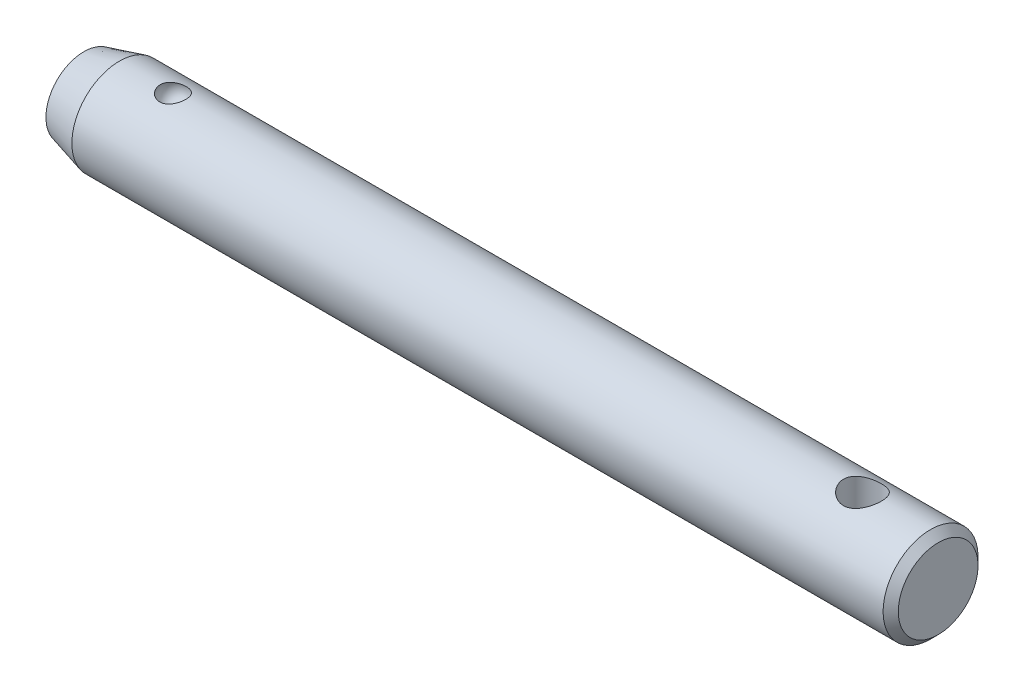
ISO-10303-21;
HEADER;
FILE_DESCRIPTION(('STEP AP214'),'2;1');
FILE_NAME('part.step','',(''),(''),'','','');
FILE_SCHEMA(('AUTOMOTIVE_DESIGN { 1 0 10303 214 1 1 1 1 }'));
ENDSEC;
DATA;
#1=APPLICATION_CONTEXT('core data for automotive mechanical design processes');
#2=APPLICATION_PROTOCOL_DEFINITION('international standard','automotive_design',2000,#1);
#3=PRODUCT_CONTEXT('',#1,'mechanical');
#4=PRODUCT('Part','Part','',(#3));
#5=PRODUCT_RELATED_PRODUCT_CATEGORY('part','',(#4));
#6=PRODUCT_DEFINITION_FORMATION('','',#4);
#7=PRODUCT_DEFINITION_CONTEXT('part definition',#1,'design');
#8=PRODUCT_DEFINITION('design','',#6,#7);
#9=PRODUCT_DEFINITION_SHAPE('','',#8);
#10=(LENGTH_UNIT() NAMED_UNIT(*) SI_UNIT(.MILLI.,.METRE.));
#11=(NAMED_UNIT(*) PLANE_ANGLE_UNIT() SI_UNIT($,.RADIAN.));
#12=(NAMED_UNIT(*) SI_UNIT($,.STERADIAN.) SOLID_ANGLE_UNIT());
#13=UNCERTAINTY_MEASURE_WITH_UNIT(LENGTH_MEASURE(1.E-05),#10,'distance_accuracy_value','');
#14=(GEOMETRIC_REPRESENTATION_CONTEXT(3) GLOBAL_UNCERTAINTY_ASSIGNED_CONTEXT((#13)) GLOBAL_UNIT_ASSIGNED_CONTEXT((#10,
#11,#12)) REPRESENTATION_CONTEXT('',''));
#15=CARTESIAN_POINT('',(0.,0.,0.));
#16=DIRECTION('',(0.,0.,1.));
#17=DIRECTION('',(1.,0.,0.));
#18=AXIS2_PLACEMENT_3D('',#15,#16,#17);
#19=CARTESIAN_POINT('',(21.4249,2.00025000000003,0.));
#20=DIRECTION('',(-1.,0.,0.));
#21=DIRECTION('',(0.,-1.,0.));
#22=AXIS2_PLACEMENT_3D('',#19,#20,#21);
#23=PLANE('',#22);
#24=CARTESIAN_POINT('',(21.4248999999995,0.,0.));
#25=DIRECTION('',(-1.,0.,0.));
#26=DIRECTION('',(0.,0.,1.));
#27=AXIS2_PLACEMENT_3D('',#24,#25,#26);
#28=CIRCLE('',#27,2.00025000003734);
#29=CARTESIAN_POINT('',(21.4248999999995,0.,2.00025000003734));
#30=VERTEX_POINT('',#29);
#31=EDGE_CURVE('E20',#30,#30,#28,.T.);
#32=ORIENTED_EDGE('',*,*,#31,.F.);
#33=EDGE_LOOP('',(#32));
#34=FACE_BOUND('',#33,.T.);
#35=ADVANCED_FACE('F17',(#34),#23,.F.);
#36=CARTESIAN_POINT('',(-21.4249,1.905,0.));
#37=DIRECTION('',(1.,0.,0.));
#38=DIRECTION('',(0.,1.,0.));
#39=AXIS2_PLACEMENT_3D('',#36,#37,#38);
#40=PLANE('',#39);
#41=CARTESIAN_POINT('',(-21.4249000000564,0.,0.));
#42=DIRECTION('',(1.,0.,0.));
#43=DIRECTION('',(0.,0.,-1.));
#44=AXIS2_PLACEMENT_3D('',#41,#42,#43);
#45=CIRCLE('',#44,1.90500000000885);
#46=CARTESIAN_POINT('',(-21.4249000000564,0.,-1.90500000000885));
#47=VERTEX_POINT('',#46);
#48=EDGE_CURVE('E80',#47,#47,#45,.T.);
#49=ORIENTED_EDGE('',*,*,#48,.F.);
#50=EDGE_LOOP('',(#49));
#51=FACE_BOUND('',#50,.T.);
#52=ADVANCED_FACE('F89',(#51),#40,.F.);
#53=CARTESIAN_POINT('',(21.0439000001088,0.,0.));
#54=DIRECTION('',(-1.,0.,0.));
#55=DIRECTION('',(0.,0.,1.));
#56=AXIS2_PLACEMENT_3D('',#53,#54,#55);
#57=CONICAL_SURFACE('',#56,2.38124999992806,0.785398163397448);
#58=CARTESIAN_POINT('',(21.0439,0.,0.));
#59=DIRECTION('',(-1.,0.,0.));
#60=DIRECTION('',(0.,-1.,0.));
#61=AXIS2_PLACEMENT_3D('',#58,#59,#60);
#62=CIRCLE('',#61,2.38125);
#63=CARTESIAN_POINT('',(21.0439,-2.38125000000001,0.));
#64=VERTEX_POINT('',#63);
#65=EDGE_CURVE('E43',#64,#64,#62,.T.);
#66=ORIENTED_EDGE('',*,*,#65,.F.);
#67=EDGE_LOOP('',(#66));
#68=FACE_BOUND('',#67,.T.);
#69=ORIENTED_EDGE('',*,*,#31,.T.);
#70=EDGE_LOOP('',(#69));
#71=FACE_BOUND('',#70,.T.);
#72=ADVANCED_FACE('F32',(#68,#71),#57,.T.);
#73=CARTESIAN_POINT('',(-16.95746933077,2.143125,0.));
#74=DIRECTION('',(0.,1.,0.));
#75=DIRECTION('',(1.,0.,0.));
#76=AXIS2_PLACEMENT_3D('',#73,#74,#75);
#77=SPHERICAL_SURFACE('',#76,0.682624999999999);
#78=CARTESIAN_POINT('',(-16.95746933077,1.4605,0.));
#79=VERTEX_POINT('',#78);
#80=VERTEX_LOOP('',#79);
#81=FACE_BOUND('',#80,.T.);
#82=CARTESIAN_POINT('',(-16.3177245574424,2.38125,0.));
#83=CARTESIAN_POINT('',(-16.3177253677787,2.38124937289952,0.0381350441003204));
#84=CARTESIAN_POINT('',(-16.3207994036191,2.38032541169528,0.0762785130369543));
#85=CARTESIAN_POINT('',(-16.3330482914089,2.37672191128368,0.151552622755821));
#86=CARTESIAN_POINT('',(-16.3422337720925,2.37403931365901,0.188681381478269));
#87=CARTESIAN_POINT('',(-16.3665265131778,2.36720350054489,0.260788113248953));
#88=CARTESIAN_POINT('',(-16.3816309706073,2.36305098123685,0.295767095281833));
#89=CARTESIAN_POINT('',(-16.4174492148012,2.35372684236225,0.362574166634676));
#90=CARTESIAN_POINT('',(-16.4381622449431,2.34855536028411,0.394402680177171));
#91=CARTESIAN_POINT('',(-16.4845541803152,2.33781881963637,0.453714841996176));
#92=CARTESIAN_POINT('',(-16.5101915963913,2.33225727992687,0.481231527923191));
#93=CARTESIAN_POINT('',(-16.5659299367686,2.32135041050113,0.531360055651512));
#94=CARTESIAN_POINT('',(-16.5960303955105,2.31600505830737,0.553972408439839));
#95=CARTESIAN_POINT('',(-16.6588446535189,2.30634787745912,0.592875406584319));
#96=CARTESIAN_POINT('',(-16.6914411372026,2.30200801714359,0.609348246951435));
#97=CARTESIAN_POINT('',(-16.7591333684968,2.29467577614861,0.636406286471084));
#98=CARTESIAN_POINT('',(-16.7942282311991,2.29168292109253,0.646993558661371));
#99=CARTESIAN_POINT('',(-16.8640892708424,2.28752841641015,0.66152846609814));
#100=CARTESIAN_POINT('',(-16.8987889715677,2.28628506064821,0.665772974380508));
#101=CARTESIAN_POINT('',(-16.9684270108427,2.28551023878046,0.66842865805681));
#102=CARTESIAN_POINT('',(-17.00336530134,2.28597843755574,0.666840975381616));
#103=CARTESIAN_POINT('',(-17.0714381040601,2.28853233510444,0.658020344958105));
#104=CARTESIAN_POINT('',(-17.1045956363411,2.29057147672235,0.650949849350848));
#105=CARTESIAN_POINT('',(-17.1692343577586,2.29598329010998,0.631595129596202));
#106=CARTESIAN_POINT('',(-17.2007154559033,2.29935603418002,0.619310622772217));
#107=CARTESIAN_POINT('',(-17.2616638874353,2.3071331808023,0.589682089659259));
#108=CARTESIAN_POINT('',(-17.2910927553238,2.31155266711654,0.572263079834961));
#109=CARTESIAN_POINT('',(-17.3466974555343,2.32092935249309,0.532959336334129));
#110=CARTESIAN_POINT('',(-17.3728728654811,2.32588662121603,0.511074023799148));
#111=CARTESIAN_POINT('',(-17.422501568537,2.33606772374327,0.462367802451901));
#112=CARTESIAN_POINT('',(-17.4457807719319,2.34129356408862,0.435369936437008));
#113=CARTESIAN_POINT('',(-17.4876970506828,2.35125350817705,0.37790014743016));
#114=CARTESIAN_POINT('',(-17.5063328242859,2.35598747381014,0.3474272537208));
#115=CARTESIAN_POINT('',(-17.5392787427023,2.36467259289021,0.282474719554657));
#116=CARTESIAN_POINT('',(-17.5533740732921,2.36858246454471,0.247880485066725));
#117=CARTESIAN_POINT('',(-17.575830876903,2.37494397132871,0.176811415168422));
#118=CARTESIAN_POINT('',(-17.5842013329655,2.37739789022402,0.140339623037332));
#119=CARTESIAN_POINT('',(-17.5946849223732,2.38049081718998,0.0692037689284664));
#120=CARTESIAN_POINT('',(-17.5972148394312,2.38125056905701,0.0346053531866554));
#121=CARTESIAN_POINT('',(-17.5972132937615,2.38124937289897,-0.0381350441002635));
#122=CARTESIAN_POINT('',(-17.594139257921,2.38032541169514,-0.0762785130369269));
#123=CARTESIAN_POINT('',(-17.581890370131,2.37672191128383,-0.151552622755857));
#124=CARTESIAN_POINT('',(-17.5727048894474,2.37403931365904,-0.188681381478339));
#125=CARTESIAN_POINT('',(-17.5484121483621,2.36720350054484,-0.260788113249051));
#126=CARTESIAN_POINT('',(-17.5333076909326,2.36305098123682,-0.295767095281928));
#127=CARTESIAN_POINT('',(-17.4974894467387,2.35372684236224,-0.362574166634766));
#128=CARTESIAN_POINT('',(-17.4767764165968,2.3485553602841,-0.394402680177259));
#129=CARTESIAN_POINT('',(-17.4303844812248,2.33781881963635,-0.453714841996257));
#130=CARTESIAN_POINT('',(-17.4047470651486,2.33225727992686,-0.481231527923266));
#131=CARTESIAN_POINT('',(-17.3490087247713,2.32135041050112,-0.531360055651576));
#132=CARTESIAN_POINT('',(-17.3189082660294,2.31600505830735,-0.553972408439898));
#133=CARTESIAN_POINT('',(-17.256094008021,2.30634787745911,-0.592875406584368));
#134=CARTESIAN_POINT('',(-17.2234975243373,2.30200801714357,-0.609348246951479));
#135=CARTESIAN_POINT('',(-17.1558052930431,2.2946757761486,-0.636406286471115));
#136=CARTESIAN_POINT('',(-17.1207104303408,2.29168292109253,-0.646993558661396));
#137=CARTESIAN_POINT('',(-17.0508493906975,2.28752841641014,-0.661528466098153));
#138=CARTESIAN_POINT('',(-17.0161496899722,2.28628506064821,-0.665772974380516));
#139=CARTESIAN_POINT('',(-16.9465116506972,2.28551023878046,-0.668428658056808));
#140=CARTESIAN_POINT('',(-16.9115733601999,2.28597843755574,-0.66684097538161));
#141=CARTESIAN_POINT('',(-16.8435005574798,2.28853233510444,-0.658020344958089));
#142=CARTESIAN_POINT('',(-16.8103430251988,2.29057147672236,-0.650949849350826));
#143=CARTESIAN_POINT('',(-16.7457043037813,2.29598329010999,-0.63159512959617));
#144=CARTESIAN_POINT('',(-16.7142232056366,2.29935603418003,-0.61931062277218));
#145=CARTESIAN_POINT('',(-16.6532747741046,2.30713318080232,-0.589682089659211));
#146=CARTESIAN_POINT('',(-16.6238459062161,2.31155266711655,-0.572263079834907));
#147=CARTESIAN_POINT('',(-16.5682412060056,2.3209293524931,-0.532959336334067));
#148=CARTESIAN_POINT('',(-16.5420657960588,2.32588662121605,-0.511074023799085));
#149=CARTESIAN_POINT('',(-16.4924370930029,2.33606772374329,-0.462367802451831));
#150=CARTESIAN_POINT('',(-16.469157889608,2.34129356408864,-0.435369936436933));
#151=CARTESIAN_POINT('',(-16.4272416108572,2.35125350817706,-0.377900147430077));
#152=CARTESIAN_POINT('',(-16.4086058372541,2.35598747381014,-0.347427253720714));
#153=CARTESIAN_POINT('',(-16.3756599188376,2.36467259289023,-0.282474719554562));
#154=CARTESIAN_POINT('',(-16.3615645882478,2.36858246454476,-0.247880485066625));
#155=CARTESIAN_POINT('',(-16.339107784637,2.37494397132868,-0.176811415168318));
#156=CARTESIAN_POINT('',(-16.3307373285744,2.37739789022388,-0.140339623037229));
#157=CARTESIAN_POINT('',(-16.3202537391669,2.38049081719013,-0.0692037689283692));
#158=CARTESIAN_POINT('',(-16.3177238221089,2.38125056905751,-0.0346053531865637));
#159=CARTESIAN_POINT('',(-16.3177245574424,2.38125,0.));
#160=B_SPLINE_CURVE_WITH_KNOTS('',3,(#82,#83,#84,#85,#86,#87,#88,#89,#90,#91,#92,#93,#94,#95,
#96,#97,#98,#99,#100,#101,#102,#103,#104,#105,#106,#107,#108,#109,#110,#111,#112,#113,#114,#115,
#116,#117,#118,#119,#120,#121,#122,#123,#124,#125,#126,#127,#128,#129,#130,#131,#132,#133,#134,
#135,#136,#137,#138,#139,#140,#141,#142,#143,#144,#145,#146,#147,#148,#149,#150,#151,#152,#153,
#154,#155,#156,#157,#158,#159),.UNSPECIFIED.,.T.,.F.,(4,2,2,2,2,2,2,2,2,2,2,2,2,2,2,2,2,2,2,2,2,
2,2,2,2,2,2,2,2,2,2,2,2,2,2,2,2,2,4),(0.,0.114285787788637,0.228770857351951,0.343201777111528,
0.457617267292192,0.571108008249131,0.684586918813929,0.794363165868979,0.904100722568208,
1.0085208062489,1.11292044578402,1.21433973590153,1.31576452514846,1.41875082995503,
1.52175049086385,1.62935647994241,1.73699260174923,1.84915426923597,1.96113953480586,
2.0648472961035,2.17913308389223,2.29361815345565,2.40804907321523,2.52246456339589,
2.63595530435283,2.74943421491763,2.85921046197267,2.9689480186719,3.07336810235259,
3.1777677418877,3.2791870320052,3.38061182125215,3.48359812605872,3.58659778696753,
3.6942037760461,3.80183989785292,3.91400156533966,4.02598683090955,4.12969459220718),.UNSPECIFIED.);
#161=CARTESIAN_POINT('',(-16.3177245574424,2.38125,0.));
#162=VERTEX_POINT('',#161);
#163=EDGE_CURVE('E36',#162,#162,#160,.T.);
#164=ORIENTED_EDGE('',*,*,#163,.F.);
#165=EDGE_LOOP('',(#164));
#166=FACE_BOUND('',#165,.T.);
#167=ADVANCED_FACE('F28',(#81,#166),#77,.F.);
#168=CARTESIAN_POINT('',(-19.647510803054,0.,0.));
#169=DIRECTION('',(1.,0.,0.));
#170=DIRECTION('',(0.,0.,-1.));
#171=AXIS2_PLACEMENT_3D('',#168,#169,#170);
#172=CONICAL_SURFACE('',#171,2.38124999998491,0.261799387800982);
#173=CARTESIAN_POINT('',(-19.6475108028953,0.,0.));
#174=DIRECTION('',(-1.,0.,0.));
#175=DIRECTION('',(0.,-1.,0.));
#176=AXIS2_PLACEMENT_3D('',#173,#174,#175);
#177=CIRCLE('',#176,2.38125);
#178=CARTESIAN_POINT('',(-19.6475108028953,-2.38125000000001,0.));
#179=VERTEX_POINT('',#178);
#180=EDGE_CURVE('E24',#179,#179,#177,.F.);
#181=ORIENTED_EDGE('',*,*,#180,.F.);
#182=EDGE_LOOP('',(#181));
#183=FACE_BOUND('',#182,.T.);
#184=ORIENTED_EDGE('',*,*,#48,.T.);
#185=EDGE_LOOP('',(#184));
#186=FACE_BOUND('',#185,.T.);
#187=ADVANCED_FACE('F31',(#183,#186),#172,.T.);
#188=CARTESIAN_POINT('',(17.6276,-2.38125,0.));
#189=DIRECTION('',(0.,-1.,0.));
#190=DIRECTION('',(0.,0.,-1.));
#191=AXIS2_PLACEMENT_3D('',#188,#189,#190);
#192=CYLINDRICAL_SURFACE('',#191,0.952500000000002);
#193=CARTESIAN_POINT('',(18.5801,2.38125,0.));
#194=CARTESIAN_POINT('',(18.5800980217383,2.38124840660397,0.0512827656094126));
#195=CARTESIAN_POINT('',(18.5759407010468,2.37957694408214,0.102586796659491));
#196=CARTESIAN_POINT('',(18.5594785352757,2.37306501909924,0.203682087632428));
#197=CARTESIAN_POINT('',(18.5471674227995,2.36822211895086,0.253472153033092));
#198=CARTESIAN_POINT('',(18.5149166648044,2.35588746377405,0.350013478905893));
#199=CARTESIAN_POINT('',(18.4949962709171,2.34840239707701,0.396772062688192));
#200=CARTESIAN_POINT('',(18.4481818652031,2.33151762770134,0.486265202892904));
#201=CARTESIAN_POINT('',(18.4212870858417,2.32211771431728,0.528999315714161));
#202=CARTESIAN_POINT('',(18.3599611467132,2.3018635857919,0.611266618074458));
#203=CARTESIAN_POINT('',(18.3252573594166,2.29096442801425,0.650585393098528));
#204=CARTESIAN_POINT('',(18.2498697803088,2.26914400356924,0.723029308056852));
#205=CARTESIAN_POINT('',(18.2091828098871,2.25822272821218,0.756151134431016));
#206=CARTESIAN_POINT('',(18.120773138379,2.23705014726573,0.816722084731498));
#207=CARTESIAN_POINT('',(18.0728164700112,2.2268509838443,0.84384950449439));
#208=CARTESIAN_POINT('',(17.9725761309017,2.20900130857024,0.889534663446545));
#209=CARTESIAN_POINT('',(17.9202982876186,2.20134743200664,0.908103728889349));
#210=CARTESIAN_POINT('',(17.8277882680257,2.19127207963432,0.932091749820611));
#211=CARTESIAN_POINT('',(17.7882118093933,2.18798962263678,0.939725273965529));
#212=CARTESIAN_POINT('',(17.7082946117372,2.18357875032177,0.94992977692222));
#213=CARTESIAN_POINT('',(17.6679540109268,2.18244994915176,0.952501662588163));
#214=CARTESIAN_POINT('',(17.5765021243126,2.18245385971025,0.952497894763837));
#215=CARTESIAN_POINT('',(17.5253827473202,2.18426869119329,0.948369453498012));
#216=CARTESIAN_POINT('',(17.4246721774556,2.19128781657014,0.93203249578508));
#217=CARTESIAN_POINT('',(17.3750823417164,2.19649503471655,0.919817008120197));
#218=CARTESIAN_POINT('',(17.2789669819132,2.20961020525916,0.887845262326929));
#219=CARTESIAN_POINT('',(17.2324324543509,2.21750975447778,0.868112444637582));
#220=CARTESIAN_POINT('',(17.1433254060443,2.235107422601,0.821741550167197));
#221=CARTESIAN_POINT('',(17.1007535402929,2.24480583805226,0.795102334564372));
#222=CARTESIAN_POINT('',(17.0183534111591,2.26552501969827,0.734055676826382));
#223=CARTESIAN_POINT('',(16.9787802584988,2.27658820515947,0.699318188648871));
#224=CARTESIAN_POINT('',(16.905831454361,2.29844113921793,0.623751253107263));
#225=CARTESIAN_POINT('',(16.8724583639749,2.30923077323579,0.582919300775681));
#226=CARTESIAN_POINT('',(16.8115774707875,2.32983559061388,0.494332996236024));
#227=CARTESIAN_POINT('',(16.7843562194164,2.33959484612527,0.446367704847795));
#228=CARTESIAN_POINT('',(16.7384996792298,2.35650964032114,0.346102441235495));
#229=CARTESIAN_POINT('',(16.7198538297207,2.3636683792713,0.293807894741356));
#230=CARTESIAN_POINT('',(16.6956971550235,2.373068376679,0.201108315405993));
#231=CARTESIAN_POINT('',(16.6879920704473,2.37611790892317,0.161343999032472));
#232=CARTESIAN_POINT('',(16.6776930392673,2.38020922140588,0.081057485167966));
#233=CARTESIAN_POINT('',(16.6750984363246,2.38125125946645,0.0405353856739462));
#234=CARTESIAN_POINT('',(16.6751019782617,2.38124840660397,-0.0512827656094111));
#235=CARTESIAN_POINT('',(16.6792592989532,2.37957694408214,-0.102586796659489));
#236=CARTESIAN_POINT('',(16.6957214647243,2.37306501909924,-0.203682087632426));
#237=CARTESIAN_POINT('',(16.7080325772005,2.36822211895086,-0.253472153033091));
#238=CARTESIAN_POINT('',(16.7402833351956,2.35588746377405,-0.350013478905893));
#239=CARTESIAN_POINT('',(16.7602037290829,2.34840239707701,-0.396772062688193));
#240=CARTESIAN_POINT('',(16.8070181347969,2.33151762770134,-0.486265202892905));
#241=CARTESIAN_POINT('',(16.8339129141583,2.32211771431728,-0.528999315714161));
#242=CARTESIAN_POINT('',(16.8952388532868,2.3018635857919,-0.611266618074458));
#243=CARTESIAN_POINT('',(16.9299426405834,2.29096442801425,-0.650585393098528));
#244=CARTESIAN_POINT('',(17.0053302196912,2.26914400356924,-0.723029308056852));
#245=CARTESIAN_POINT('',(17.0460171901129,2.25822272821218,-0.756151134431016));
#246=CARTESIAN_POINT('',(17.134426861621,2.23705014726573,-0.816722084731498));
#247=CARTESIAN_POINT('',(17.1823835299888,2.2268509838443,-0.84384950449439));
#248=CARTESIAN_POINT('',(17.2826238690983,2.20900130857024,-0.889534663446545));
#249=CARTESIAN_POINT('',(17.3349017123814,2.20134743200664,-0.908103728889349));
#250=CARTESIAN_POINT('',(17.4274117319742,2.19127207963433,-0.932091749820586));
#251=CARTESIAN_POINT('',(17.4669881906065,2.18798962263679,-0.939725273965491));
#252=CARTESIAN_POINT('',(17.5469053882624,2.18357875032179,-0.949929776922182));
#253=CARTESIAN_POINT('',(17.5872459890727,2.18244994915177,-0.952501662588137));
#254=CARTESIAN_POINT('',(17.6786978756868,2.18245385971024,-0.95249789476387));
#255=CARTESIAN_POINT('',(17.7298172526792,2.18426869119326,-0.948369453498079));
#256=CARTESIAN_POINT('',(17.8305278225438,2.19128781657008,-0.932032495785215));
#257=CARTESIAN_POINT('',(17.880117658283,2.19649503471648,-0.919817008120366));
#258=CARTESIAN_POINT('',(17.9762330180862,2.20961020525907,-0.887845262327166));
#259=CARTESIAN_POINT('',(18.0227675456485,2.21750975447768,-0.868112444637852));
#260=CARTESIAN_POINT('',(18.1118745939552,2.23510742260088,-0.821741550167533));
#261=CARTESIAN_POINT('',(18.1544464597066,2.24480583805213,-0.795102334564741));
#262=CARTESIAN_POINT('',(18.2368465888404,2.26552501969813,-0.734055676826817));
#263=CARTESIAN_POINT('',(18.2764197415008,2.27658820515932,-0.699318188649339));
#264=CARTESIAN_POINT('',(18.3493685456386,2.29844113921779,-0.623751253107797));
#265=CARTESIAN_POINT('',(18.3827416360246,2.30923077323565,-0.582919300776248));
#266=CARTESIAN_POINT('',(18.4436225292122,2.32983559061374,-0.494332996236646));
#267=CARTESIAN_POINT('',(18.4708437805833,2.33959484612515,-0.446367704848438));
#268=CARTESIAN_POINT('',(18.5167003207699,2.35650964032104,-0.346102441236175));
#269=CARTESIAN_POINT('',(18.5353461702791,2.36366837927121,-0.293807894742051));
#270=CARTESIAN_POINT('',(18.5595028449764,2.37306837667896,-0.20110831540659));
#271=CARTESIAN_POINT('',(18.5672079295527,2.37611790892314,-0.161343999032953));
#272=CARTESIAN_POINT('',(18.5775069607327,2.38020922140587,-0.0810574851682095));
#273=CARTESIAN_POINT('',(18.5801015636754,2.38125125946645,-0.0405353856740674));
#274=CARTESIAN_POINT('',(18.5801,2.38125,0.));
#275=B_SPLINE_CURVE_WITH_KNOTS('',3,(#193,#194,#195,#196,#197,#198,#199,#200,#201,#202,#203,
#204,#205,#206,#207,#208,#209,#210,#211,#212,#213,#214,#215,#216,#217,#218,#219,#220,#221,#222,
#223,#224,#225,#226,#227,#228,#229,#230,#231,#232,#233,#234,#235,#236,#237,#238,#239,#240,#241,
#242,#243,#244,#245,#246,#247,#248,#249,#250,#251,#252,#253,#254,#255,#256,#257,#258,#259,#260,
#261,#262,#263,#264,#265,#266,#267,#268,#269,#270,#271,#272,#273,#274),.UNSPECIFIED.,.T.,.F.,(4,
2,2,2,2,2,2,2,2,2,2,2,2,2,2,2,2,2,2,2,2,2,2,2,2,2,2,2,2,2,2,2,2,2,2,2,2,2,2,2,4),(0.,
0.153694272295808,0.307506818720828,0.460932766588978,0.614375606233235,0.774366387019257,
0.93444247323325,1.10171015703485,1.26875583613258,1.38971674025211,1.51065597077915,
1.66379410067692,1.81706441130927,1.96986065737973,2.12268211463725,2.28339324165391,
2.44417060754488,2.61135160370942,2.77832615982928,2.89982617665344,3.02131058821653,
3.17500486051233,3.32881740693735,3.48224335480551,3.63568619444976,3.79567697523578,
3.95575306144978,4.12302074525138,4.2900664243491,4.41102732846834,4.53196655899507,
4.68510468889282,4.83837499952515,4.99117124559559,5.1439927028531,5.30470382986973,
5.46548119576068,5.63266219192521,5.79963674804508,5.92113676486961,6.04262117643306),.UNSPECIFIED.);
#276=CARTESIAN_POINT('',(18.5801,2.38125,0.));
#277=VERTEX_POINT('',#276);
#278=EDGE_CURVE('E38',#277,#277,#275,.T.);
#279=ORIENTED_EDGE('',*,*,#278,.F.);
#280=EDGE_LOOP('',(#279));
#281=FACE_BOUND('',#280,.T.);
#282=CARTESIAN_POINT('',(16.6751,-2.38125000000001,0.));
#283=CARTESIAN_POINT('',(16.6751019782617,-2.38124840660398,0.051282765609412));
#284=CARTESIAN_POINT('',(16.6792592989532,-2.37957694408215,0.10258679665949));
#285=CARTESIAN_POINT('',(16.6957214647243,-2.37306501909924,0.203682087632427));
#286=CARTESIAN_POINT('',(16.7080325772005,-2.36822211895087,0.253472153033091));
#287=CARTESIAN_POINT('',(16.7402833351956,-2.35588746377406,0.350013478905893));
#288=CARTESIAN_POINT('',(16.7602037290829,-2.34840239707701,0.396772062688193));
#289=CARTESIAN_POINT('',(16.8070181347969,-2.33151762770135,0.486265202892905));
#290=CARTESIAN_POINT('',(16.8339129141583,-2.32211771431729,0.528999315714161));
#291=CARTESIAN_POINT('',(16.8952388532868,-2.30186358579191,0.611266618074458));
#292=CARTESIAN_POINT('',(16.9299426405834,-2.29096442801425,0.650585393098528));
#293=CARTESIAN_POINT('',(17.0053302196912,-2.26914400356924,0.723029308056852));
#294=CARTESIAN_POINT('',(17.0460171901129,-2.25822272821219,0.756151134431016));
#295=CARTESIAN_POINT('',(17.134426861621,-2.23705014726573,0.816722084731498));
#296=CARTESIAN_POINT('',(17.1823835299888,-2.2268509838443,0.84384950449439));
#297=CARTESIAN_POINT('',(17.2826238690983,-2.20900130857025,0.889534663446545));
#298=CARTESIAN_POINT('',(17.3349017123814,-2.20134743200664,0.908103728889349));
#299=CARTESIAN_POINT('',(17.4274117319743,-2.19127207963433,0.932091749820612));
#300=CARTESIAN_POINT('',(17.4669881906068,-2.18798962263678,0.93972527396553));
#301=CARTESIAN_POINT('',(17.5469053882628,-2.18357875032177,0.94992977692222));
#302=CARTESIAN_POINT('',(17.5872459890733,-2.18244994915176,0.952501662588163));
#303=CARTESIAN_POINT('',(17.6786978756874,-2.18245385971026,0.952497894763837));
#304=CARTESIAN_POINT('',(17.7298172526799,-2.18426869119329,0.948369453498012));
#305=CARTESIAN_POINT('',(17.8305278225444,-2.19128781657014,0.93203249578508));
#306=CARTESIAN_POINT('',(17.8801176582836,-2.19649503471655,0.919817008120197));
#307=CARTESIAN_POINT('',(17.9762330180868,-2.20961020525917,0.887845262326929));
#308=CARTESIAN_POINT('',(18.0227675456491,-2.21750975447778,0.868112444637583));
#309=CARTESIAN_POINT('',(18.1118745939557,-2.235107422601,0.821741550167198));
#310=CARTESIAN_POINT('',(18.1544464597071,-2.24480583805227,0.795102334564373));
#311=CARTESIAN_POINT('',(18.2368465888409,-2.26552501969827,0.734055676826382));
#312=CARTESIAN_POINT('',(18.2764197415013,-2.27658820515947,0.69931818864887));
#313=CARTESIAN_POINT('',(18.349368545639,-2.29844113921794,0.623751253107262));
#314=CARTESIAN_POINT('',(18.3827416360251,-2.30923077323579,0.58291930077568));
#315=CARTESIAN_POINT('',(18.4436225292126,-2.32983559061388,0.494332996236024));
#316=CARTESIAN_POINT('',(18.4708437805837,-2.33959484612527,0.446367704847795));
#317=CARTESIAN_POINT('',(18.5167003207702,-2.35650964032114,0.346102441235495));
#318=CARTESIAN_POINT('',(18.5353461702793,-2.3636683792713,0.293807894741356));
#319=CARTESIAN_POINT('',(18.5595028449765,-2.37306837667901,0.201108315405992));
#320=CARTESIAN_POINT('',(18.5672079295528,-2.37611790892318,0.161343999032472));
#321=CARTESIAN_POINT('',(18.5775069607327,-2.38020922140588,0.0810574851679659));
#322=CARTESIAN_POINT('',(18.5801015636754,-2.38125125946645,0.0405353856739459));
#323=CARTESIAN_POINT('',(18.5800980217383,-2.38124840660398,-0.051282765609412));
#324=CARTESIAN_POINT('',(18.5759407010468,-2.37957694408214,-0.10258679665949));
#325=CARTESIAN_POINT('',(18.5594785352757,-2.37306501909924,-0.203682087632427));
#326=CARTESIAN_POINT('',(18.5471674227995,-2.36822211895087,-0.253472153033091));
#327=CARTESIAN_POINT('',(18.5149166648044,-2.35588746377406,-0.350013478905893));
#328=CARTESIAN_POINT('',(18.4949962709171,-2.34840239707701,-0.396772062688192));
#329=CARTESIAN_POINT('',(18.4481818652031,-2.33151762770135,-0.486265202892904));
#330=CARTESIAN_POINT('',(18.4212870858417,-2.32211771431729,-0.528999315714161));
#331=CARTESIAN_POINT('',(18.3599611467132,-2.30186358579191,-0.611266618074458));
#332=CARTESIAN_POINT('',(18.3252573594166,-2.29096442801425,-0.650585393098528));
#333=CARTESIAN_POINT('',(18.2498697803088,-2.26914400356924,-0.723029308056852));
#334=CARTESIAN_POINT('',(18.2091828098871,-2.25822272821219,-0.756151134431016));
#335=CARTESIAN_POINT('',(18.120773138379,-2.23705014726573,-0.816722084731498));
#336=CARTESIAN_POINT('',(18.0728164700112,-2.2268509838443,-0.84384950449439));
#337=CARTESIAN_POINT('',(17.9725761309017,-2.20900130857025,-0.889534663446545));
#338=CARTESIAN_POINT('',(17.9202982876186,-2.20134743200664,-0.908103728889349));
#339=CARTESIAN_POINT('',(17.8277882680258,-2.19127207963434,-0.932091749820586));
#340=CARTESIAN_POINT('',(17.7882118093935,-2.18798962263679,-0.939725273965491));
#341=CARTESIAN_POINT('',(17.7082946117376,-2.18357875032179,-0.949929776922182));
#342=CARTESIAN_POINT('',(17.6679540109273,-2.18244994915177,-0.952501662588137));
#343=CARTESIAN_POINT('',(17.5765021243132,-2.18245385971024,-0.95249789476387));
#344=CARTESIAN_POINT('',(17.5253827473208,-2.18426869119326,-0.948369453498079));
#345=CARTESIAN_POINT('',(17.4246721774563,-2.19128781657008,-0.932032495785214));
#346=CARTESIAN_POINT('',(17.375082341717,-2.19649503471648,-0.919817008120366));
#347=CARTESIAN_POINT('',(17.2789669819138,-2.20961020525907,-0.887845262327166));
#348=CARTESIAN_POINT('',(17.2324324543515,-2.21750975447768,-0.868112444637852));
#349=CARTESIAN_POINT('',(17.1433254060449,-2.23510742260088,-0.821741550167533));
#350=CARTESIAN_POINT('',(17.1007535402935,-2.24480583805214,-0.795102334564741));
#351=CARTESIAN_POINT('',(17.0183534111596,-2.26552501969813,-0.734055676826817));
#352=CARTESIAN_POINT('',(16.9787802584993,-2.27658820515932,-0.699318188649339));
#353=CARTESIAN_POINT('',(16.9058314543614,-2.29844113921779,-0.623751253107798));
#354=CARTESIAN_POINT('',(16.8724583639754,-2.30923077323565,-0.582919300776248));
#355=CARTESIAN_POINT('',(16.8115774707878,-2.32983559061375,-0.494332996236646));
#356=CARTESIAN_POINT('',(16.7843562194167,-2.33959484612515,-0.446367704848438));
#357=CARTESIAN_POINT('',(16.7384996792301,-2.35650964032104,-0.346102441236175));
#358=CARTESIAN_POINT('',(16.7198538297209,-2.36366837927121,-0.293807894742051));
#359=CARTESIAN_POINT('',(16.6956971550236,-2.37306837667896,-0.20110831540659));
#360=CARTESIAN_POINT('',(16.6879920704473,-2.37611790892314,-0.161343999032953));
#361=CARTESIAN_POINT('',(16.6776930392673,-2.38020922140587,-0.0810574851682097));
#362=CARTESIAN_POINT('',(16.6750984363246,-2.38125125946645,-0.0405353856740677));
#363=CARTESIAN_POINT('',(16.6751,-2.38125000000001,0.));
#364=B_SPLINE_CURVE_WITH_KNOTS('',3,(#282,#283,#284,#285,#286,#287,#288,#289,#290,#291,#292,
#293,#294,#295,#296,#297,#298,#299,#300,#301,#302,#303,#304,#305,#306,#307,#308,#309,#310,#311,
#312,#313,#314,#315,#316,#317,#318,#319,#320,#321,#322,#323,#324,#325,#326,#327,#328,#329,#330,
#331,#332,#333,#334,#335,#336,#337,#338,#339,#340,#341,#342,#343,#344,#345,#346,#347,#348,#349,
#350,#351,#352,#353,#354,#355,#356,#357,#358,#359,#360,#361,#362,#363),.UNSPECIFIED.,.T.,.F.,(4,
2,2,2,2,2,2,2,2,2,2,2,2,2,2,2,2,2,2,2,2,2,2,2,2,2,2,2,2,2,2,2,2,2,2,2,2,2,2,2,4),(0.,
0.153694272295808,0.307506818720828,0.46093276658898,0.614375606233235,0.774366387019257,
0.93444247323325,1.10171015703485,1.26875583613258,1.38971674025212,1.51065597077915,
1.66379410067692,1.81706441130927,1.96986065737972,2.12268211463725,2.28339324165391,
2.44417060754488,2.61135160370942,2.77832615982929,2.89982617665344,3.02131058821653,
3.17500486051234,3.32881740693736,3.48224335480551,3.63568619444976,3.79567697523578,
3.95575306144978,4.12302074525138,4.2900664243491,4.41102732846834,4.53196655899507,
4.68510468889282,4.83837499952515,4.99117124559559,5.1439927028531,5.30470382986973,
5.46548119576068,5.63266219192521,5.79963674804508,5.92113676486961,6.04262117643306),.UNSPECIFIED.);
#365=CARTESIAN_POINT('',(16.6751,-2.38125000000001,0.));
#366=VERTEX_POINT('',#365);
#367=EDGE_CURVE('E11',#366,#366,#364,.T.);
#368=ORIENTED_EDGE('',*,*,#367,.F.);
#369=EDGE_LOOP('',(#368));
#370=FACE_BOUND('',#369,.T.);
#371=ADVANCED_FACE('F63',(#281,#370),#192,.F.);
#372=CARTESIAN_POINT('',(21.4249,0.,0.));
#373=DIRECTION('',(-1.,0.,0.));
#374=DIRECTION('',(0.,-1.,0.));
#375=AXIS2_PLACEMENT_3D('',#372,#373,#374);
#376=CYLINDRICAL_SURFACE('',#375,2.38125);
#377=ORIENTED_EDGE('',*,*,#278,.T.);
#378=EDGE_LOOP('',(#377));
#379=FACE_BOUND('',#378,.T.);
#380=ORIENTED_EDGE('',*,*,#163,.T.);
#381=EDGE_LOOP('',(#380));
#382=FACE_BOUND('',#381,.T.);
#383=ORIENTED_EDGE('',*,*,#180,.T.);
#384=EDGE_LOOP('',(#383));
#385=FACE_BOUND('',#384,.T.);
#386=ORIENTED_EDGE('',*,*,#367,.T.);
#387=EDGE_LOOP('',(#386));
#388=FACE_BOUND('',#387,.T.);
#389=ORIENTED_EDGE('',*,*,#65,.T.);
#390=EDGE_LOOP('',(#389));
#391=FACE_BOUND('',#390,.T.);
#392=ADVANCED_FACE('F60',(#379,#382,#385,#388,#391),#376,.T.);
#393=CLOSED_SHELL('',(#35,#52,#72,#167,#187,#371,#392));
#394=MANIFOLD_SOLID_BREP('B1',#393);
#395=ADVANCED_BREP_SHAPE_REPRESENTATION('',(#18,#394),#14);
#396=SHAPE_DEFINITION_REPRESENTATION(#9,#395);
ENDSEC;
END-ISO-10303-21;
